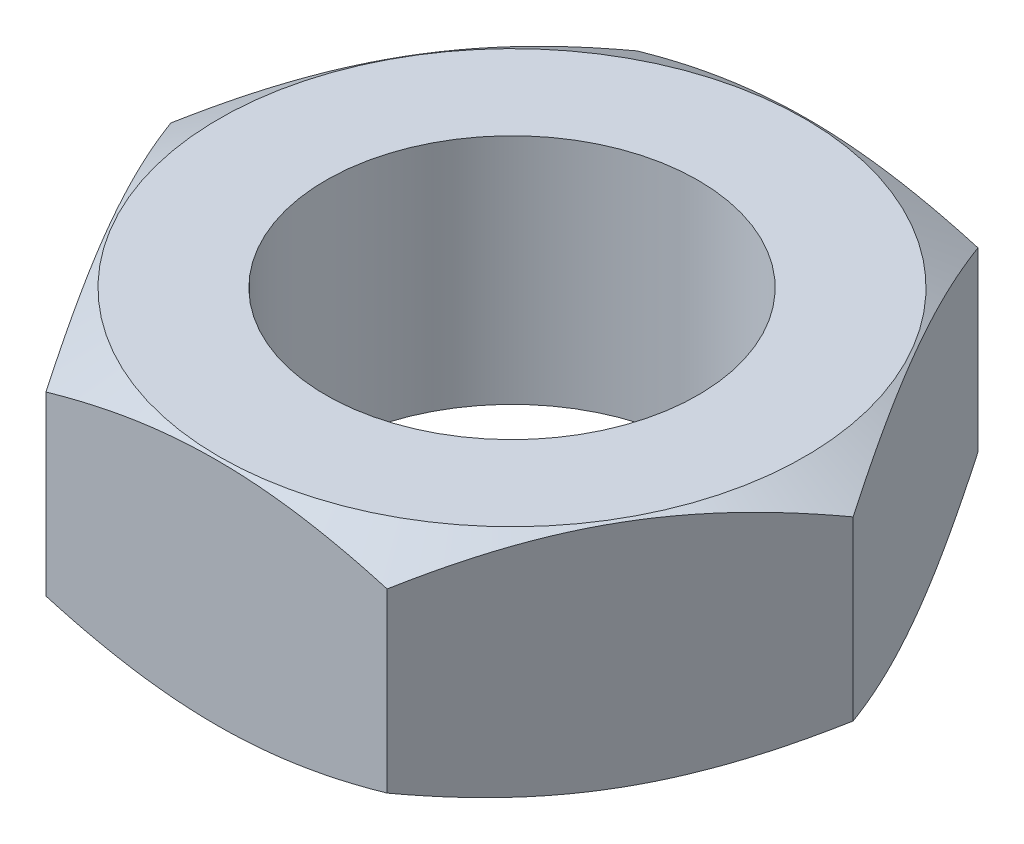
ISO-10303-21;
HEADER;
FILE_DESCRIPTION(('STEP AP214'),'2;1');
FILE_NAME('part.step','',(''),(''),'','','');
FILE_SCHEMA(('AUTOMOTIVE_DESIGN { 1 0 10303 214 1 1 1 1 }'));
ENDSEC;
DATA;
#1=APPLICATION_CONTEXT('core data for automotive mechanical design processes');
#2=APPLICATION_PROTOCOL_DEFINITION('international standard','automotive_design',2000,#1);
#3=PRODUCT_CONTEXT('',#1,'mechanical');
#4=PRODUCT('Part','Part','',(#3));
#5=PRODUCT_RELATED_PRODUCT_CATEGORY('part','',(#4));
#6=PRODUCT_DEFINITION_FORMATION('','',#4);
#7=PRODUCT_DEFINITION_CONTEXT('part definition',#1,'design');
#8=PRODUCT_DEFINITION('design','',#6,#7);
#9=PRODUCT_DEFINITION_SHAPE('','',#8);
#10=(LENGTH_UNIT() NAMED_UNIT(*) SI_UNIT(.MILLI.,.METRE.));
#11=(NAMED_UNIT(*) PLANE_ANGLE_UNIT() SI_UNIT($,.RADIAN.));
#12=(NAMED_UNIT(*) SI_UNIT($,.STERADIAN.) SOLID_ANGLE_UNIT());
#13=UNCERTAINTY_MEASURE_WITH_UNIT(LENGTH_MEASURE(1.E-05),#10,'distance_accuracy_value','');
#14=(GEOMETRIC_REPRESENTATION_CONTEXT(3) GLOBAL_UNCERTAINTY_ASSIGNED_CONTEXT((#13)) GLOBAL_UNIT_ASSIGNED_CONTEXT((#10,
#11,#12)) REPRESENTATION_CONTEXT('',''));
#15=CARTESIAN_POINT('',(0.,0.,0.));
#16=DIRECTION('',(0.,0.,1.));
#17=DIRECTION('',(1.,0.,0.));
#18=AXIS2_PLACEMENT_3D('',#15,#16,#17);
#19=CARTESIAN_POINT('',(0.,-1.25,0.));
#20=DIRECTION('',(0.,-1.,0.));
#21=DIRECTION('',(0.,0.,-1.));
#22=AXIS2_PLACEMENT_3D('',#19,#20,#21);
#23=PLANE('',#22);
#24=CARTESIAN_POINT('',(0.,-1.25,0.));
#25=DIRECTION('',(0.,-1.,0.));
#26=DIRECTION('',(0.,0.,-1.));
#27=AXIS2_PLACEMENT_3D('',#24,#25,#26);
#28=CIRCLE('',#27,2.);
#29=CARTESIAN_POINT('',(0.,-1.25,-2.));
#30=VERTEX_POINT('',#29);
#31=EDGE_CURVE('E198',#30,#30,#28,.T.);
#32=ORIENTED_EDGE('',*,*,#31,.F.);
#33=EDGE_LOOP('',(#32));
#34=FACE_BOUND('',#33,.T.);
#35=CARTESIAN_POINT('',(0.,-1.25,0.));
#36=DIRECTION('',(0.,1.,0.));
#37=DIRECTION('',(0.,0.,1.));
#38=AXIS2_PLACEMENT_3D('',#35,#36,#37);
#39=CIRCLE('',#38,3.14655896708346);
#40=CARTESIAN_POINT('',(0.,-1.25,3.14655896708346));
#41=VERTEX_POINT('',#40);
#42=EDGE_CURVE('E259',#41,#41,#39,.T.);
#43=ORIENTED_EDGE('',*,*,#42,.F.);
#44=EDGE_LOOP('',(#43));
#45=FACE_BOUND('',#44,.T.);
#46=ADVANCED_FACE('F41',(#34,#45),#23,.T.);
#47=CARTESIAN_POINT('',(0.,1.25,0.));
#48=DIRECTION('',(0.,-1.,0.));
#49=DIRECTION('',(0.,0.,-1.));
#50=AXIS2_PLACEMENT_3D('',#47,#48,#49);
#51=PLANE('',#50);
#52=CARTESIAN_POINT('',(0.,1.25,0.));
#53=DIRECTION('',(0.,-1.,0.));
#54=DIRECTION('',(0.,0.,-1.));
#55=AXIS2_PLACEMENT_3D('',#52,#53,#54);
#56=CIRCLE('',#55,2.);
#57=CARTESIAN_POINT('',(0.,1.25,-2.));
#58=VERTEX_POINT('',#57);
#59=EDGE_CURVE('E196',#58,#58,#56,.T.);
#60=ORIENTED_EDGE('',*,*,#59,.T.);
#61=EDGE_LOOP('',(#60));
#62=FACE_BOUND('',#61,.T.);
#63=CARTESIAN_POINT('',(0.,1.25,0.));
#64=DIRECTION('',(0.,1.,0.));
#65=DIRECTION('',(0.,0.,1.));
#66=AXIS2_PLACEMENT_3D('',#63,#64,#65);
#67=CIRCLE('',#66,3.14655896708346);
#68=CARTESIAN_POINT('',(0.,1.25,3.14655896708346));
#69=VERTEX_POINT('',#68);
#70=EDGE_CURVE('E256',#69,#69,#67,.T.);
#71=ORIENTED_EDGE('',*,*,#70,.T.);
#72=EDGE_LOOP('',(#71));
#73=FACE_BOUND('',#72,.T.);
#74=ADVANCED_FACE('F238',(#62,#73),#51,.F.);
#75=CARTESIAN_POINT('',(0.,-1.25,0.));
#76=DIRECTION('',(0.,1.,0.));
#77=DIRECTION('',(0.,0.,1.));
#78=AXIS2_PLACEMENT_3D('',#75,#76,#77);
#79=CYLINDRICAL_SURFACE('',#78,2.);
#80=ORIENTED_EDGE('',*,*,#31,.T.);
#81=EDGE_LOOP('',(#80));
#82=FACE_BOUND('',#81,.T.);
#83=ORIENTED_EDGE('',*,*,#59,.F.);
#84=EDGE_LOOP('',(#83));
#85=FACE_BOUND('',#84,.T.);
#86=ADVANCED_FACE('F141',(#82,#85),#79,.F.);
#87=CARTESIAN_POINT('',(0.,-0.95,0.));
#88=DIRECTION('',(0.,1.,0.));
#89=DIRECTION('',(0.,0.,1.));
#90=AXIS2_PLACEMENT_3D('',#87,#88,#89);
#91=CONICAL_SURFACE('',#90,3.66617420935412,1.0471975511966);
#92=ORIENTED_EDGE('',*,*,#42,.T.);
#93=EDGE_LOOP('',(#92));
#94=FACE_BOUND('',#93,.T.);
#95=CARTESIAN_POINT('',(1.83297163462323,-0.949933330183825,-3.1752));
#96=CARTESIAN_POINT('',(1.91352665998975,-0.996459627966395,-3.03567460326018));
#97=CARTESIAN_POINT('',(1.99477703088899,-1.03877369708128,-2.89494483272887));
#98=CARTESIAN_POINT('',(2.1586847273538,-1.11263355328131,-2.61104837470026));
#99=CARTESIAN_POINT('',(2.24134496547056,-1.14415321108056,-2.46787664251628));
#100=CARTESIAN_POINT('',(2.40564101629246,-1.19321845700633,-2.18330753500984));
#101=CARTESIAN_POINT('',(2.48725154909053,-1.21109059508647,-2.04195394577081));
#102=CARTESIAN_POINT('',(2.65085664790703,-1.2324267479573,-1.7585816022433));
#103=CARTESIAN_POINT('',(2.73285061920893,-1.2359084303577,-1.61656387803408));
#104=CARTESIAN_POINT('',(2.88606277807967,-1.22866786126739,-1.35119263453263));
#105=CARTESIAN_POINT('',(2.95730389328231,-1.21972341584597,-1.22779940341379));
#106=CARTESIAN_POINT('',(3.09932198517026,-1.19137398562116,-0.981816852669884));
#107=CARTESIAN_POINT('',(3.17009847059057,-1.17195931527969,-0.859228383940738));
#108=CARTESIAN_POINT('',(3.31240941048281,-1.12342383117838,-0.612738605574498));
#109=CARTESIAN_POINT('',(3.38392585192423,-1.0940972635168,-0.488868495421443));
#110=CARTESIAN_POINT('',(3.52589204292736,-1.02753736832745,-0.242975839646996));
#111=CARTESIAN_POINT('',(3.59634361148865,-0.99031968153969,-0.120950143425914));
#112=CARTESIAN_POINT('',(3.66628967940796,-0.949933330183827,0.000199999999998595));
#113=B_SPLINE_CURVE_WITH_KNOTS('',3,(#95,#96,#97,#98,#99,#100,#101,#102,#103,#104,#105,#106,
#107,#108,#109,#110,#111,#112),.UNSPECIFIED.,.F.,.F.,(4,2,2,2,2,2,2,2,4),(0.,0.503278731073366,
1.00776724301492,1.49976968502821,1.9911679005965,2.41904879402148,2.84732618162394,
3.28510386250597,3.72202181665388),.UNSPECIFIED.);
#114=CARTESIAN_POINT('',(1.83308710467706,-0.95,-3.175));
#115=VERTEX_POINT('',#114);
#116=CARTESIAN_POINT('',(3.66617420935412,-0.95,0.));
#117=VERTEX_POINT('',#116);
#118=EDGE_CURVE('E101',#115,#117,#113,.T.);
#119=ORIENTED_EDGE('',*,*,#118,.T.);
#120=CARTESIAN_POINT('',(3.66628967940796,-0.949933330183827,-0.000200000000000431));
#121=CARTESIAN_POINT('',(3.58573465404144,-0.996459627966396,0.139325396739818));
#122=CARTESIAN_POINT('',(3.50448428314219,-1.03877369708128,0.280055167271128));
#123=CARTESIAN_POINT('',(3.34057658667739,-1.11263355328131,0.563951625299741));
#124=CARTESIAN_POINT('',(3.25791634856063,-1.14415321108056,0.707123357483716));
#125=CARTESIAN_POINT('',(3.09362029773873,-1.19321845700633,0.991692464990165));
#126=CARTESIAN_POINT('',(3.01200976494066,-1.21109059508647,1.1330460542292));
#127=CARTESIAN_POINT('',(2.84840466612415,-1.2324267479573,1.4164183977567));
#128=CARTESIAN_POINT('',(2.76641069482226,-1.2359084303577,1.55843612196593));
#129=CARTESIAN_POINT('',(2.61319853595151,-1.22866786126739,1.82380736546737));
#130=CARTESIAN_POINT('',(2.54195742074888,-1.21972341584597,1.94720059658621));
#131=CARTESIAN_POINT('',(2.39993932886093,-1.19137398562116,2.19318314733012));
#132=CARTESIAN_POINT('',(2.32916284344061,-1.1719593152797,2.31577161605926));
#133=CARTESIAN_POINT('',(2.18685190354837,-1.12342383117838,2.5622613944255));
#134=CARTESIAN_POINT('',(2.11533546210696,-1.0940972635168,2.68613150457856));
#135=CARTESIAN_POINT('',(1.97336927110383,-1.02753736832745,2.932024160353));
#136=CARTESIAN_POINT('',(1.90291770254254,-0.99031968153969,3.05404985657409));
#137=CARTESIAN_POINT('',(1.83297163462323,-0.949933330183827,3.1752));
#138=B_SPLINE_CURVE_WITH_KNOTS('',3,(#120,#121,#122,#123,#124,#125,#126,#127,#128,#129,#130,
#131,#132,#133,#134,#135,#136,#137),.UNSPECIFIED.,.F.,.F.,(4,2,2,2,2,2,2,2,4),(0.,
0.503278731073366,1.00776724301492,1.49976968502821,1.9911679005965,2.41904879402148,
2.84732618162393,3.28510386250597,3.72202181665388),.UNSPECIFIED.);
#139=CARTESIAN_POINT('',(1.83308710467706,-0.95,3.175));
#140=VERTEX_POINT('',#139);
#141=EDGE_CURVE('E97',#117,#140,#138,.T.);
#142=ORIENTED_EDGE('',*,*,#141,.T.);
#143=CARTESIAN_POINT('',(5.51171521099277,0.605736250910529,3.175));
#144=CARTESIAN_POINT('',(5.37979871793226,0.539751065297416,3.175));
#145=CARTESIAN_POINT('',(5.24765205834997,0.474221195927034,3.175));
#146=CARTESIAN_POINT('',(4.98279349023958,0.344292134590762,3.175));
#147=CARTESIAN_POINT('',(4.85008154455377,0.279893018423128,3.175));
#148=CARTESIAN_POINT('',(4.58373696154433,0.152325963988015,3.175));
#149=CARTESIAN_POINT('',(4.45010300772905,0.0891607685535177,3.175));
#150=CARTESIAN_POINT('',(4.18205975046093,-0.0354987653282683,3.175));
#151=CARTESIAN_POINT('',(4.04765046224957,-0.0969931364857635,3.175));
#152=CARTESIAN_POINT('',(3.7718361028333,-0.220647201903418,3.175));
#153=CARTESIAN_POINT('',(3.63038845935846,-0.282712253143556,3.175));
#154=CARTESIAN_POINT('',(3.34628778194245,-0.404016285280332,3.175));
#155=CARTESIAN_POINT('',(3.20363479040986,-0.463255365121696,3.175));
#156=CARTESIAN_POINT('',(2.91696653993373,-0.578114998683086,3.175));
#157=CARTESIAN_POINT('',(2.77295212185764,-0.633737637641035,3.175));
#158=CARTESIAN_POINT('',(2.48324225262746,-0.740391304883294,3.175));
#159=CARTESIAN_POINT('',(2.33754698760164,-0.791422836160129,3.175));
#160=CARTESIAN_POINT('',(2.00982581103205,-0.898888336401685,3.175));
#161=CARTESIAN_POINT('',(1.82728675839257,-0.953786082052629,3.175));
#162=CARTESIAN_POINT('',(1.4589502135161,-1.05151893153533,3.175));
#163=CARTESIAN_POINT('',(1.2731530144879,-1.09435511495953,3.175));
#164=CARTESIAN_POINT('',(0.901718089153501,-1.16373404986914,3.175));
#165=CARTESIAN_POINT('',(0.716131399786595,-1.19054153671001,3.175));
#166=CARTESIAN_POINT('',(0.343238996115582,-1.22594880184509,3.175));
#167=CARTESIAN_POINT('',(0.155934047438269,-1.23455632829624,3.175));
#168=CARTESIAN_POINT('',(-0.219686448786184,-1.23241809052602,3.175));
#169=CARTESIAN_POINT('',(-0.408001312541329,-1.2215558274123,3.175));
#170=CARTESIAN_POINT('',(-0.782713595409705,-1.1817059302079,3.175));
#171=CARTESIAN_POINT('',(-0.969110076287176,-1.15270981905699,3.175));
#172=CARTESIAN_POINT('',(-1.34202374544874,-1.07917815101309,3.175));
#173=CARTESIAN_POINT('',(-1.52848873383983,-1.03438590778507,3.175));
#174=CARTESIAN_POINT('',(-1.89822739570804,-0.933018822812108,3.175));
#175=CARTESIAN_POINT('',(-2.08149921020955,-0.876437350756791,3.175));
#176=CARTESIAN_POINT('',(-2.4065371685003,-0.767502219463566,3.175));
#177=CARTESIAN_POINT('',(-2.54886529576136,-0.716795398220686,3.175));
#178=CARTESIAN_POINT('',(-2.83189347586891,-0.611156751473583,3.175));
#179=CARTESIAN_POINT('',(-2.97259396476513,-0.556226089190985,3.175));
#180=CARTESIAN_POINT('',(-3.25273748272035,-0.442997401294558,3.175));
#181=CARTESIAN_POINT('',(-3.39217958338415,-0.384697092507674,3.175));
#182=CARTESIAN_POINT('',(-3.66993004303759,-0.26545309063886,3.175));
#183=CARTESIAN_POINT('',(-3.80823836668191,-0.204509315517109,3.175));
#184=CARTESIAN_POINT('',(-4.07807615103167,-0.0831292224166281,3.175));
#185=CARTESIAN_POINT('',(-4.20964505745637,-0.0227803211305427,3.175));
#186=CARTESIAN_POINT('',(-4.47204255771311,0.0994979765031581,3.175));
#187=CARTESIAN_POINT('',(-4.60287116299798,0.161427348318021,3.175));
#188=CARTESIAN_POINT('',(-4.86367276902128,0.286474107249289,3.175));
#189=CARTESIAN_POINT('',(-4.99364687577518,0.349589192287732,3.175));
#190=CARTESIAN_POINT('',(-5.25305941543206,0.476902419828492,3.175));
#191=CARTESIAN_POINT('',(-5.38249786317646,0.541100532069968,3.175));
#192=CARTESIAN_POINT('',(-5.51171521099276,0.605736250910528,3.175));
#193=B_SPLINE_CURVE_WITH_KNOTS('',3,(#143,#144,#145,#146,#147,#148,#149,#150,#151,#152,#153,
#154,#155,#156,#157,#158,#159,#160,#161,#162,#163,#164,#165,#166,#167,#168,#169,#170,#171,#172,
#173,#174,#175,#176,#177,#178,#179,#180,#181,#182,#183,#184,#185,#186,#187,#188,#189,#190,#191,
#192),.UNSPECIFIED.,.F.,.F.,(4,2,2,2,2,2,2,2,2,2,2,2,2,2,2,2,2,2,2,2,2,2,2,2,4),(0.,
0.442499854594996,0.88502925909126,1.32845051903956,1.77186309173848,2.23523437082655,
2.69858941413641,3.16167487339169,3.62470953599437,4.19624728974484,4.76773387067823,
5.32950030060291,5.89102752497643,6.4559259120745,7.02108857076029,7.59589377926525,
8.17102313739134,8.6242210954403,9.07729468931304,9.53067895568921,9.98407730290115,
10.418312899667,10.8525417601335,11.2860004089142,11.719446966429),.UNSPECIFIED.);
#194=CARTESIAN_POINT('',(-1.83308710467706,-0.95,3.175));
#195=VERTEX_POINT('',#194);
#196=EDGE_CURVE('E102',#140,#195,#193,.T.);
#197=ORIENTED_EDGE('',*,*,#196,.T.);
#198=CARTESIAN_POINT('',(-1.83297163462322,-0.949933330183827,3.1752));
#199=CARTESIAN_POINT('',(-1.91352665998975,-0.996459627966396,3.03567460326018));
#200=CARTESIAN_POINT('',(-1.99477703088899,-1.03877369708128,2.89494483272887));
#201=CARTESIAN_POINT('',(-2.15868472735379,-1.11263355328131,2.61104837470026));
#202=CARTESIAN_POINT('',(-2.24134496547056,-1.14415321108056,2.46787664251628));
#203=CARTESIAN_POINT('',(-2.40564101629246,-1.19321845700633,2.18330753500984));
#204=CARTESIAN_POINT('',(-2.48725154909053,-1.21109059508647,2.04195394577081));
#205=CARTESIAN_POINT('',(-2.65085664790703,-1.2324267479573,1.7585816022433));
#206=CARTESIAN_POINT('',(-2.73285061920892,-1.2359084303577,1.61656387803408));
#207=CARTESIAN_POINT('',(-2.88606277807967,-1.22866786126739,1.35119263453263));
#208=CARTESIAN_POINT('',(-2.95730389328231,-1.21972341584597,1.22779940341379));
#209=CARTESIAN_POINT('',(-3.09932198517025,-1.19137398562116,0.981816852669884));
#210=CARTESIAN_POINT('',(-3.17009847059057,-1.1719593152797,0.859228383940737));
#211=CARTESIAN_POINT('',(-3.31240941048281,-1.12342383117838,0.612738605574497));
#212=CARTESIAN_POINT('',(-3.38392585192423,-1.0940972635168,0.488868495421442));
#213=CARTESIAN_POINT('',(-3.52589204292736,-1.02753736832745,0.242975839646995));
#214=CARTESIAN_POINT('',(-3.59634361148865,-0.990319681539691,0.120950143425914));
#215=CARTESIAN_POINT('',(-3.66628967940796,-0.949933330183827,-0.0001999999999994));
#216=B_SPLINE_CURVE_WITH_KNOTS('',3,(#198,#199,#200,#201,#202,#203,#204,#205,#206,#207,#208,
#209,#210,#211,#212,#213,#214,#215),.UNSPECIFIED.,.F.,.F.,(4,2,2,2,2,2,2,2,4),(0.,
0.503278731073366,1.00776724301492,1.49976968502821,1.9911679005965,2.41904879402148,
2.84732618162394,3.28510386250597,3.72202181665388),.UNSPECIFIED.);
#217=CARTESIAN_POINT('',(-3.66617420935412,-0.95,0.));
#218=VERTEX_POINT('',#217);
#219=EDGE_CURVE('E120',#195,#218,#216,.T.);
#220=ORIENTED_EDGE('',*,*,#219,.T.);
#221=CARTESIAN_POINT('',(-3.66628967940796,-0.949933330183827,0.000200000000000672));
#222=CARTESIAN_POINT('',(-3.58573465404144,-0.996459627966396,-0.139325396739818));
#223=CARTESIAN_POINT('',(-3.50448428314219,-1.03877369708128,-0.280055167271128));
#224=CARTESIAN_POINT('',(-3.34057658667739,-1.11263355328132,-0.56395162529974));
#225=CARTESIAN_POINT('',(-3.25791634856063,-1.14415321108056,-0.707123357483716));
#226=CARTESIAN_POINT('',(-3.09362029773873,-1.19321845700633,-0.991692464990165));
#227=CARTESIAN_POINT('',(-3.01200976494065,-1.21109059508647,-1.1330460542292));
#228=CARTESIAN_POINT('',(-2.84840466612415,-1.2324267479573,-1.4164183977567));
#229=CARTESIAN_POINT('',(-2.76641069482226,-1.2359084303577,-1.55843612196592));
#230=CARTESIAN_POINT('',(-2.61319853595151,-1.22866786126739,-1.82380736546737));
#231=CARTESIAN_POINT('',(-2.54195742074888,-1.21972341584597,-1.94720059658621));
#232=CARTESIAN_POINT('',(-2.39993932886093,-1.19137398562116,-2.19318314733012));
#233=CARTESIAN_POINT('',(-2.32916284344061,-1.1719593152797,-2.31577161605926));
#234=CARTESIAN_POINT('',(-2.18685190354837,-1.12342383117838,-2.5622613944255));
#235=CARTESIAN_POINT('',(-2.11533546210696,-1.0940972635168,-2.68613150457856));
#236=CARTESIAN_POINT('',(-1.97336927110383,-1.02753736832745,-2.93202416035301));
#237=CARTESIAN_POINT('',(-1.90291770254254,-0.99031968153969,-3.05404985657409));
#238=CARTESIAN_POINT('',(-1.83297163462322,-0.949933330183827,-3.1752));
#239=B_SPLINE_CURVE_WITH_KNOTS('',3,(#221,#222,#223,#224,#225,#226,#227,#228,#229,#230,#231,
#232,#233,#234,#235,#236,#237,#238),.UNSPECIFIED.,.F.,.F.,(4,2,2,2,2,2,2,2,4),(0.,
0.503278731073367,1.00776724301492,1.49976968502821,1.9911679005965,2.41904879402148,
2.84732618162394,3.28510386250597,3.72202181665389),.UNSPECIFIED.);
#240=CARTESIAN_POINT('',(-1.83308710467706,-0.95,-3.175));
#241=VERTEX_POINT('',#240);
#242=EDGE_CURVE('E65',#218,#241,#239,.T.);
#243=ORIENTED_EDGE('',*,*,#242,.T.);
#244=CARTESIAN_POINT('',(-5.51171521099276,0.605736250910528,-3.175));
#245=CARTESIAN_POINT('',(-5.37979871793226,0.539751065297416,-3.175));
#246=CARTESIAN_POINT('',(-5.24765205834997,0.474221195927034,-3.175));
#247=CARTESIAN_POINT('',(-4.98279349023958,0.344292134590762,-3.175));
#248=CARTESIAN_POINT('',(-4.85008154455376,0.279893018423128,-3.175));
#249=CARTESIAN_POINT('',(-4.58373696154432,0.152325963988014,-3.175));
#250=CARTESIAN_POINT('',(-4.45010300772905,0.0891607685535168,-3.175));
#251=CARTESIAN_POINT('',(-4.18205975046092,-0.0354987653282692,-3.175));
#252=CARTESIAN_POINT('',(-4.04765046224956,-0.0969931364857645,-3.175));
#253=CARTESIAN_POINT('',(-3.7718361028333,-0.220647201903419,-3.175));
#254=CARTESIAN_POINT('',(-3.63038845935845,-0.282712253143557,-3.175));
#255=CARTESIAN_POINT('',(-3.34628778194244,-0.404016285280333,-3.175));
#256=CARTESIAN_POINT('',(-3.20363479040986,-0.463255365121697,-3.175));
#257=CARTESIAN_POINT('',(-2.91696653993373,-0.578114998683086,-3.175));
#258=CARTESIAN_POINT('',(-2.77295212185764,-0.633737637641035,-3.175));
#259=CARTESIAN_POINT('',(-2.48324225262746,-0.740391304883294,-3.175));
#260=CARTESIAN_POINT('',(-2.33754698760164,-0.791422836160129,-3.175));
#261=CARTESIAN_POINT('',(-2.00982581103205,-0.898888336401685,-3.175));
#262=CARTESIAN_POINT('',(-1.82728675839257,-0.953786082052628,-3.175));
#263=CARTESIAN_POINT('',(-1.4589502135161,-1.05151893153533,-3.175));
#264=CARTESIAN_POINT('',(-1.2731530144879,-1.09435511495953,-3.175));
#265=CARTESIAN_POINT('',(-0.9017180891535,-1.16373404986914,-3.175));
#266=CARTESIAN_POINT('',(-0.716131399786593,-1.19054153671001,-3.175));
#267=CARTESIAN_POINT('',(-0.343238996115581,-1.22594880184509,-3.175));
#268=CARTESIAN_POINT('',(-0.155934047438267,-1.23455632829624,-3.175));
#269=CARTESIAN_POINT('',(0.219686448786186,-1.23241809052602,-3.175));
#270=CARTESIAN_POINT('',(0.408001312541331,-1.2215558274123,-3.175));
#271=CARTESIAN_POINT('',(0.782713595409708,-1.18170593020789,-3.175));
#272=CARTESIAN_POINT('',(0.969110076287178,-1.15270981905699,-3.175));
#273=CARTESIAN_POINT('',(1.34202374544874,-1.07917815101309,-3.175));
#274=CARTESIAN_POINT('',(1.52848873383983,-1.03438590778507,-3.175));
#275=CARTESIAN_POINT('',(1.89822739570804,-0.933018822812106,-3.175));
#276=CARTESIAN_POINT('',(2.08149921020955,-0.87643735075679,-3.175));
#277=CARTESIAN_POINT('',(2.4065371685003,-0.767502219463565,-3.175));
#278=CARTESIAN_POINT('',(2.54886529576137,-0.716795398220684,-3.175));
#279=CARTESIAN_POINT('',(2.83189347586891,-0.611156751473582,-3.175));
#280=CARTESIAN_POINT('',(2.97259396476513,-0.556226089190983,-3.175));
#281=CARTESIAN_POINT('',(3.25273748272036,-0.442997401294556,-3.175));
#282=CARTESIAN_POINT('',(3.39217958338415,-0.384697092507672,-3.175));
#283=CARTESIAN_POINT('',(3.66993004303759,-0.265453090638859,-3.175));
#284=CARTESIAN_POINT('',(3.80823836668191,-0.204509315517107,-3.175));
#285=CARTESIAN_POINT('',(4.07807615103167,-0.0831292224166266,-3.175));
#286=CARTESIAN_POINT('',(4.20964505745637,-0.0227803211305412,-3.175));
#287=CARTESIAN_POINT('',(4.47204255771312,0.0994979765031594,-3.175));
#288=CARTESIAN_POINT('',(4.60287116299798,0.161427348318022,-3.175));
#289=CARTESIAN_POINT('',(4.86367276902128,0.28647410724929,-3.175));
#290=CARTESIAN_POINT('',(4.99364687577518,0.349589192287733,-3.175));
#291=CARTESIAN_POINT('',(5.25305941543206,0.476902419828493,-3.175));
#292=CARTESIAN_POINT('',(5.38249786317646,0.541100532069969,-3.175));
#293=CARTESIAN_POINT('',(5.51171521099277,0.605736250910529,-3.175));
#294=B_SPLINE_CURVE_WITH_KNOTS('',3,(#244,#245,#246,#247,#248,#249,#250,#251,#252,#253,#254,
#255,#256,#257,#258,#259,#260,#261,#262,#263,#264,#265,#266,#267,#268,#269,#270,#271,#272,#273,
#274,#275,#276,#277,#278,#279,#280,#281,#282,#283,#284,#285,#286,#287,#288,#289,#290,#291,#292,
#293),.UNSPECIFIED.,.F.,.F.,(4,2,2,2,2,2,2,2,2,2,2,2,2,2,2,2,2,2,2,2,2,2,2,2,4),(0.,
0.442499854594995,0.885029259091261,1.32845051903956,1.77186309173848,2.23523437082655,
2.69858941413641,3.16167487339169,3.62470953599437,4.19624728974483,4.76773387067823,
5.32950030060291,5.89102752497643,6.45592591207449,7.02108857076029,7.59589377926525,
8.17102313739133,8.6242210954403,9.07729468931303,9.5306789556892,9.98407730290114,
10.418312899667,10.8525417601335,11.2860004089142,11.719446966429),.UNSPECIFIED.);
#295=EDGE_CURVE('E57',#241,#115,#294,.T.);
#296=ORIENTED_EDGE('',*,*,#295,.T.);
#297=EDGE_LOOP('',(#119,#142,#197,#220,#243,#296));
#298=FACE_BOUND('',#297,.T.);
#299=ADVANCED_FACE('F99',(#94,#298),#91,.T.);
#300=CARTESIAN_POINT('',(0.,1.25,0.));
#301=DIRECTION('',(0.,-1.,0.));
#302=DIRECTION('',(0.,0.,-1.));
#303=AXIS2_PLACEMENT_3D('',#300,#301,#302);
#304=CONICAL_SURFACE('',#303,3.14655896708346,1.0471975511966);
#305=ORIENTED_EDGE('',*,*,#70,.F.);
#306=EDGE_LOOP('',(#305));
#307=FACE_BOUND('',#306,.T.);
#308=CARTESIAN_POINT('',(3.66628967940796,0.949933330183825,0.000199999999999205));
#309=CARTESIAN_POINT('',(3.58573465404144,0.996459627966395,-0.139325396739819));
#310=CARTESIAN_POINT('',(3.50448428314219,1.03877369708128,-0.280055167271129));
#311=CARTESIAN_POINT('',(3.34057658667739,1.11263355328131,-0.563951625299742));
#312=CARTESIAN_POINT('',(3.25791634856063,1.14415321108056,-0.707123357483718));
#313=CARTESIAN_POINT('',(3.09362029773873,1.19321845700633,-0.991692464990167));
#314=CARTESIAN_POINT('',(3.01200976494065,1.21109059508647,-1.1330460542292));
#315=CARTESIAN_POINT('',(2.84840466612415,1.2324267479573,-1.41641839775671));
#316=CARTESIAN_POINT('',(2.76641069482226,1.2359084303577,-1.55843612196593));
#317=CARTESIAN_POINT('',(2.61319853595151,1.22866786126739,-1.82380736546737));
#318=CARTESIAN_POINT('',(2.54195742074888,1.21972341584597,-1.94720059658621));
#319=CARTESIAN_POINT('',(2.39993932886093,1.19137398562116,-2.19318314733012));
#320=CARTESIAN_POINT('',(2.32916284344061,1.17195931527969,-2.31577161605926));
#321=CARTESIAN_POINT('',(2.18685190354837,1.12342383117838,-2.5622613944255));
#322=CARTESIAN_POINT('',(2.11533546210696,1.0940972635168,-2.68613150457856));
#323=CARTESIAN_POINT('',(1.97336927110383,1.02753736832744,-2.93202416035301));
#324=CARTESIAN_POINT('',(1.90291770254254,0.990319681539689,-3.05404985657409));
#325=CARTESIAN_POINT('',(1.83297163462323,0.949933330183825,-3.1752));
#326=B_SPLINE_CURVE_WITH_KNOTS('',3,(#308,#309,#310,#311,#312,#313,#314,#315,#316,#317,#318,
#319,#320,#321,#322,#323,#324,#325),.UNSPECIFIED.,.F.,.F.,(4,2,2,2,2,2,2,2,4),(0.,
0.503278731073367,1.00776724301492,1.49976968502821,1.9911679005965,2.41904879402148,
2.84732618162394,3.28510386250597,3.72202181665388),.UNSPECIFIED.);
#327=CARTESIAN_POINT('',(3.66617420935412,0.95,0.));
#328=VERTEX_POINT('',#327);
#329=CARTESIAN_POINT('',(1.83308710467706,0.949999999999996,-3.175));
#330=VERTEX_POINT('',#329);
#331=EDGE_CURVE('E68',#328,#330,#326,.T.);
#332=ORIENTED_EDGE('',*,*,#331,.T.);
#333=CARTESIAN_POINT('',(5.51171521099277,-0.605736250910529,-3.175));
#334=CARTESIAN_POINT('',(5.37979871793226,-0.539751065297417,-3.175));
#335=CARTESIAN_POINT('',(5.24765205834997,-0.474221195927036,-3.175));
#336=CARTESIAN_POINT('',(4.98279349023958,-0.344292134590763,-3.175));
#337=CARTESIAN_POINT('',(4.85008154455377,-0.279893018423129,-3.175));
#338=CARTESIAN_POINT('',(4.58373696154433,-0.152325963988015,-3.175));
#339=CARTESIAN_POINT('',(4.45010300772905,-0.0891607685535181,-3.175));
#340=CARTESIAN_POINT('',(4.18205975046093,0.0354987653282678,-3.175));
#341=CARTESIAN_POINT('',(4.04765046224957,0.0969931364857628,-3.175));
#342=CARTESIAN_POINT('',(3.7718361028333,0.220647201903417,-3.175));
#343=CARTESIAN_POINT('',(3.63038845935845,0.282712253143555,-3.175));
#344=CARTESIAN_POINT('',(3.34628778194244,0.404016285280332,-3.175));
#345=CARTESIAN_POINT('',(3.20363479040986,0.463255365121696,-3.175));
#346=CARTESIAN_POINT('',(2.91696653993373,0.578114998683085,-3.175));
#347=CARTESIAN_POINT('',(2.77295212185764,0.633737637641034,-3.175));
#348=CARTESIAN_POINT('',(2.48324225262746,0.740391304883293,-3.175));
#349=CARTESIAN_POINT('',(2.33754698760164,0.791422836160129,-3.175));
#350=CARTESIAN_POINT('',(2.00982581103205,0.898888336401685,-3.175));
#351=CARTESIAN_POINT('',(1.82728675839257,0.953786082052628,-3.175));
#352=CARTESIAN_POINT('',(1.4589502135161,1.05151893153533,-3.175));
#353=CARTESIAN_POINT('',(1.2731530144879,1.09435511495953,-3.175));
#354=CARTESIAN_POINT('',(0.901718089153501,1.16373404986914,-3.175));
#355=CARTESIAN_POINT('',(0.716131399786595,1.19054153671,-3.175));
#356=CARTESIAN_POINT('',(0.343238996115582,1.22594880184509,-3.175));
#357=CARTESIAN_POINT('',(0.155934047438269,1.23455632829624,-3.175));
#358=CARTESIAN_POINT('',(-0.219686448786185,1.23241809052602,-3.175));
#359=CARTESIAN_POINT('',(-0.40800131254133,1.2215558274123,-3.175));
#360=CARTESIAN_POINT('',(-0.782713595409706,1.1817059302079,-3.175));
#361=CARTESIAN_POINT('',(-0.969110076287177,1.15270981905699,-3.175));
#362=CARTESIAN_POINT('',(-1.34202374544874,1.07917815101309,-3.175));
#363=CARTESIAN_POINT('',(-1.52848873383983,1.03438590778507,-3.175));
#364=CARTESIAN_POINT('',(-1.89822739570804,0.933018822812106,-3.175));
#365=CARTESIAN_POINT('',(-2.08149921020955,0.87643735075679,-3.175));
#366=CARTESIAN_POINT('',(-2.4065371685003,0.767502219463565,-3.175));
#367=CARTESIAN_POINT('',(-2.54886529576137,0.716795398220684,-3.175));
#368=CARTESIAN_POINT('',(-2.83189347586891,0.611156751473582,-3.175));
#369=CARTESIAN_POINT('',(-2.97259396476513,0.556226089190984,-3.175));
#370=CARTESIAN_POINT('',(-3.25273748272035,0.442997401294557,-3.175));
#371=CARTESIAN_POINT('',(-3.39217958338415,0.384697092507673,-3.175));
#372=CARTESIAN_POINT('',(-3.66993004303759,0.26545309063886,-3.175));
#373=CARTESIAN_POINT('',(-3.80823836668191,0.204509315517108,-3.175));
#374=CARTESIAN_POINT('',(-4.07807615103167,0.0831292224166277,-3.175));
#375=CARTESIAN_POINT('',(-4.20964505745637,0.022780321130542,-3.175));
#376=CARTESIAN_POINT('',(-4.47204255771311,-0.099497976503159,-3.175));
#377=CARTESIAN_POINT('',(-4.60287116299798,-0.161427348318022,-3.175));
#378=CARTESIAN_POINT('',(-4.86367276902128,-0.28647410724929,-3.175));
#379=CARTESIAN_POINT('',(-4.99364687577518,-0.349589192287732,-3.175));
#380=CARTESIAN_POINT('',(-5.25305941543206,-0.476902419828492,-3.175));
#381=CARTESIAN_POINT('',(-5.38249786317646,-0.541100532069969,-3.175));
#382=CARTESIAN_POINT('',(-5.51171521099277,-0.605736250910529,-3.175));
#383=B_SPLINE_CURVE_WITH_KNOTS('',3,(#333,#334,#335,#336,#337,#338,#339,#340,#341,#342,#343,
#344,#345,#346,#347,#348,#349,#350,#351,#352,#353,#354,#355,#356,#357,#358,#359,#360,#361,#362,
#363,#364,#365,#366,#367,#368,#369,#370,#371,#372,#373,#374,#375,#376,#377,#378,#379,#380,#381,
#382),.UNSPECIFIED.,.F.,.F.,(4,2,2,2,2,2,2,2,2,2,2,2,2,2,2,2,2,2,2,2,2,2,2,2,4),(0.,
0.442499854594995,0.88502925909126,1.32845051903956,1.77186309173848,2.23523437082655,
2.69858941413641,3.16167487339169,3.62470953599437,4.19624728974483,4.76773387067823,
5.32950030060291,5.89102752497643,6.4559259120745,7.02108857076029,7.59589377926525,
8.17102313739134,8.6242210954403,9.07729468931303,9.5306789556892,9.98407730290114,
10.418312899667,10.8525417601335,11.2860004089142,11.719446966429),.UNSPECIFIED.);
#384=CARTESIAN_POINT('',(-1.83308710467706,0.95,-3.175));
#385=VERTEX_POINT('',#384);
#386=EDGE_CURVE('E11',#330,#385,#383,.T.);
#387=ORIENTED_EDGE('',*,*,#386,.T.);
#388=CARTESIAN_POINT('',(-1.83297163462322,0.949933330183825,-3.1752));
#389=CARTESIAN_POINT('',(-1.91352665998975,0.996459627966395,-3.03567460326018));
#390=CARTESIAN_POINT('',(-1.99477703088899,1.03877369708128,-2.89494483272887));
#391=CARTESIAN_POINT('',(-2.15868472735379,1.11263355328131,-2.61104837470026));
#392=CARTESIAN_POINT('',(-2.24134496547056,1.14415321108056,-2.46787664251629));
#393=CARTESIAN_POINT('',(-2.40564101629246,1.19321845700633,-2.18330753500984));
#394=CARTESIAN_POINT('',(-2.48725154909053,1.21109059508647,-2.04195394577081));
#395=CARTESIAN_POINT('',(-2.65085664790703,1.2324267479573,-1.7585816022433));
#396=CARTESIAN_POINT('',(-2.73285061920892,1.2359084303577,-1.61656387803408));
#397=CARTESIAN_POINT('',(-2.88606277807967,1.22866786126739,-1.35119263453263));
#398=CARTESIAN_POINT('',(-2.95730389328231,1.21972341584597,-1.22779940341379));
#399=CARTESIAN_POINT('',(-3.09932198517025,1.19137398562116,-0.981816852669884));
#400=CARTESIAN_POINT('',(-3.17009847059057,1.1719593152797,-0.859228383940737));
#401=CARTESIAN_POINT('',(-3.31240941048281,1.12342383117838,-0.612738605574497));
#402=CARTESIAN_POINT('',(-3.38392585192423,1.0940972635168,-0.488868495421442));
#403=CARTESIAN_POINT('',(-3.52589204292735,1.02753736832745,-0.242975839646995));
#404=CARTESIAN_POINT('',(-3.59634361148865,0.990319681539691,-0.120950143425913));
#405=CARTESIAN_POINT('',(-3.66628967940796,0.949933330183827,0.0002000000000004));
#406=B_SPLINE_CURVE_WITH_KNOTS('',3,(#388,#389,#390,#391,#392,#393,#394,#395,#396,#397,#398,
#399,#400,#401,#402,#403,#404,#405),.UNSPECIFIED.,.F.,.F.,(4,2,2,2,2,2,2,2,4),(0.,
0.503278731073367,1.00776724301492,1.49976968502821,1.9911679005965,2.41904879402148,
2.84732618162394,3.28510386250597,3.72202181665388),.UNSPECIFIED.);
#407=CARTESIAN_POINT('',(-3.66617420935412,0.95,0.));
#408=VERTEX_POINT('',#407);
#409=EDGE_CURVE('E218',#385,#408,#406,.T.);
#410=ORIENTED_EDGE('',*,*,#409,.T.);
#411=CARTESIAN_POINT('',(-3.66628967940796,0.949933330183827,-0.000199999999999412));
#412=CARTESIAN_POINT('',(-3.58573465404144,0.996459627966397,0.139325396739819));
#413=CARTESIAN_POINT('',(-3.50448428314219,1.03877369708128,0.280055167271129));
#414=CARTESIAN_POINT('',(-3.34057658667739,1.11263355328131,0.563951625299741));
#415=CARTESIAN_POINT('',(-3.25791634856063,1.14415321108056,0.707123357483717));
#416=CARTESIAN_POINT('',(-3.09362029773873,1.19321845700633,0.991692464990166));
#417=CARTESIAN_POINT('',(-3.01200976494065,1.21109059508647,1.1330460542292));
#418=CARTESIAN_POINT('',(-2.84840466612415,1.2324267479573,1.4164183977567));
#419=CARTESIAN_POINT('',(-2.76641069482226,1.2359084303577,1.55843612196593));
#420=CARTESIAN_POINT('',(-2.61319853595151,1.22866786126739,1.82380736546737));
#421=CARTESIAN_POINT('',(-2.54195742074887,1.21972341584597,1.94720059658621));
#422=CARTESIAN_POINT('',(-2.39993932886093,1.19137398562116,2.19318314733012));
#423=CARTESIAN_POINT('',(-2.32916284344061,1.1719593152797,2.31577161605926));
#424=CARTESIAN_POINT('',(-2.18685190354837,1.12342383117838,2.5622613944255));
#425=CARTESIAN_POINT('',(-2.11533546210696,1.0940972635168,2.68613150457856));
#426=CARTESIAN_POINT('',(-1.97336927110383,1.02753736832745,2.93202416035301));
#427=CARTESIAN_POINT('',(-1.90291770254254,0.990319681539691,3.05404985657409));
#428=CARTESIAN_POINT('',(-1.83297163462322,0.949933330183827,3.1752));
#429=B_SPLINE_CURVE_WITH_KNOTS('',3,(#411,#412,#413,#414,#415,#416,#417,#418,#419,#420,#421,
#422,#423,#424,#425,#426,#427,#428),.UNSPECIFIED.,.F.,.F.,(4,2,2,2,2,2,2,2,4),(0.,
0.503278731073366,1.00776724301492,1.49976968502821,1.9911679005965,2.41904879402148,
2.84732618162393,3.28510386250597,3.72202181665388),.UNSPECIFIED.);
#430=CARTESIAN_POINT('',(-1.83308710467706,0.95,3.175));
#431=VERTEX_POINT('',#430);
#432=EDGE_CURVE('E217',#408,#431,#429,.T.);
#433=ORIENTED_EDGE('',*,*,#432,.T.);
#434=CARTESIAN_POINT('',(-5.51171521099276,-0.605736250910528,3.175));
#435=CARTESIAN_POINT('',(-5.37979871793225,-0.539751065297416,3.175));
#436=CARTESIAN_POINT('',(-5.24765205834997,-0.474221195927034,3.175));
#437=CARTESIAN_POINT('',(-4.98279349023958,-0.344292134590762,3.175));
#438=CARTESIAN_POINT('',(-4.85008154455376,-0.279893018423128,3.175));
#439=CARTESIAN_POINT('',(-4.58373696154433,-0.152325963988014,3.175));
#440=CARTESIAN_POINT('',(-4.45010300772905,-0.0891607685535169,3.175));
#441=CARTESIAN_POINT('',(-4.18205975046093,0.0354987653282687,3.175));
#442=CARTESIAN_POINT('',(-4.04765046224956,0.0969931364857637,3.175));
#443=CARTESIAN_POINT('',(-3.7718361028333,0.220647201903418,3.175));
#444=CARTESIAN_POINT('',(-3.63038845935845,0.282712253143556,3.175));
#445=CARTESIAN_POINT('',(-3.34628778194244,0.404016285280332,3.175));
#446=CARTESIAN_POINT('',(-3.20363479040986,0.463255365121696,3.175));
#447=CARTESIAN_POINT('',(-2.91696653993373,0.578114998683085,3.175));
#448=CARTESIAN_POINT('',(-2.77295212185764,0.633737637641035,3.175));
#449=CARTESIAN_POINT('',(-2.48324225262746,0.740391304883294,3.175));
#450=CARTESIAN_POINT('',(-2.33754698760164,0.791422836160129,3.175));
#451=CARTESIAN_POINT('',(-2.00982581103205,0.898888336401685,3.175));
#452=CARTESIAN_POINT('',(-1.82728675839257,0.953786082052629,3.175));
#453=CARTESIAN_POINT('',(-1.4589502135161,1.05151893153533,3.175));
#454=CARTESIAN_POINT('',(-1.2731530144879,1.09435511495953,3.175));
#455=CARTESIAN_POINT('',(-0.9017180891535,1.16373404986914,3.175));
#456=CARTESIAN_POINT('',(-0.716131399786594,1.19054153671001,3.175));
#457=CARTESIAN_POINT('',(-0.343238996115581,1.22594880184509,3.175));
#458=CARTESIAN_POINT('',(-0.155934047438268,1.23455632829624,3.175));
#459=CARTESIAN_POINT('',(0.219686448786185,1.23241809052602,3.175));
#460=CARTESIAN_POINT('',(0.40800131254133,1.2215558274123,3.175));
#461=CARTESIAN_POINT('',(0.782713595409706,1.1817059302079,3.175));
#462=CARTESIAN_POINT('',(0.969110076287177,1.15270981905699,3.175));
#463=CARTESIAN_POINT('',(1.34202374544874,1.07917815101309,3.175));
#464=CARTESIAN_POINT('',(1.52848873383983,1.03438590778507,3.175));
#465=CARTESIAN_POINT('',(1.89822739570804,0.933018822812108,3.175));
#466=CARTESIAN_POINT('',(2.08149921020955,0.876437350756791,3.175));
#467=CARTESIAN_POINT('',(2.4065371685003,0.767502219463566,3.175));
#468=CARTESIAN_POINT('',(2.54886529576137,0.716795398220686,3.175));
#469=CARTESIAN_POINT('',(2.83189347586891,0.611156751473583,3.175));
#470=CARTESIAN_POINT('',(2.97259396476513,0.556226089190984,3.175));
#471=CARTESIAN_POINT('',(3.25273748272036,0.442997401294557,3.175));
#472=CARTESIAN_POINT('',(3.39217958338415,0.384697092507673,3.175));
#473=CARTESIAN_POINT('',(3.66993004303759,0.26545309063886,3.175));
#474=CARTESIAN_POINT('',(3.80823836668191,0.204509315517108,3.175));
#475=CARTESIAN_POINT('',(4.07807615103167,0.0831292224166276,3.175));
#476=CARTESIAN_POINT('',(4.20964505745637,0.0227803211305422,3.175));
#477=CARTESIAN_POINT('',(4.47204255771312,-0.0994979765031588,3.175));
#478=CARTESIAN_POINT('',(4.60287116299798,-0.161427348318022,3.175));
#479=CARTESIAN_POINT('',(4.86367276902128,-0.28647410724929,3.175));
#480=CARTESIAN_POINT('',(4.99364687577518,-0.349589192287732,3.175));
#481=CARTESIAN_POINT('',(5.25305941543207,-0.476902419828492,3.175));
#482=CARTESIAN_POINT('',(5.38249786317646,-0.541100532069968,3.175));
#483=CARTESIAN_POINT('',(5.51171521099277,-0.605736250910529,3.175));
#484=B_SPLINE_CURVE_WITH_KNOTS('',3,(#434,#435,#436,#437,#438,#439,#440,#441,#442,#443,#444,
#445,#446,#447,#448,#449,#450,#451,#452,#453,#454,#455,#456,#457,#458,#459,#460,#461,#462,#463,
#464,#465,#466,#467,#468,#469,#470,#471,#472,#473,#474,#475,#476,#477,#478,#479,#480,#481,#482,
#483),.UNSPECIFIED.,.F.,.F.,(4,2,2,2,2,2,2,2,2,2,2,2,2,2,2,2,2,2,2,2,2,2,2,2,4),(0.,
0.442499854594996,0.88502925909126,1.32845051903956,1.77186309173848,2.23523437082655,
2.69858941413641,3.16167487339169,3.62470953599437,4.19624728974483,4.76773387067823,
5.32950030060291,5.89102752497643,6.45592591207449,7.02108857076029,7.59589377926524,
8.17102313739133,8.6242210954403,9.07729468931303,9.5306789556892,9.98407730290114,
10.418312899667,10.8525417601335,11.2860004089142,11.719446966429),.UNSPECIFIED.);
#485=CARTESIAN_POINT('',(1.83308710467706,0.95,3.175));
#486=VERTEX_POINT('',#485);
#487=EDGE_CURVE('E187',#431,#486,#484,.T.);
#488=ORIENTED_EDGE('',*,*,#487,.T.);
#489=CARTESIAN_POINT('',(1.83297163462323,0.949933330183827,3.1752));
#490=CARTESIAN_POINT('',(1.91352665998975,0.996459627966396,3.03567460326018));
#491=CARTESIAN_POINT('',(1.99477703088899,1.03877369708128,2.89494483272887));
#492=CARTESIAN_POINT('',(2.1586847273538,1.11263355328131,2.61104837470026));
#493=CARTESIAN_POINT('',(2.24134496547056,1.14415321108056,2.46787664251628));
#494=CARTESIAN_POINT('',(2.40564101629246,1.19321845700633,2.18330753500983));
#495=CARTESIAN_POINT('',(2.48725154909053,1.21109059508647,2.0419539457708));
#496=CARTESIAN_POINT('',(2.65085664790703,1.2324267479573,1.75858160224329));
#497=CARTESIAN_POINT('',(2.73285061920893,1.2359084303577,1.61656387803407));
#498=CARTESIAN_POINT('',(2.88606277807967,1.22866786126739,1.35119263453263));
#499=CARTESIAN_POINT('',(2.95730389328231,1.21972341584597,1.22779940341379));
#500=CARTESIAN_POINT('',(3.09932198517026,1.19137398562116,0.981816852669883));
#501=CARTESIAN_POINT('',(3.17009847059057,1.17195931527969,0.859228383940737));
#502=CARTESIAN_POINT('',(3.31240941048281,1.12342383117838,0.612738605574496));
#503=CARTESIAN_POINT('',(3.38392585192423,1.0940972635168,0.488868495421441));
#504=CARTESIAN_POINT('',(3.52589204292736,1.02753736832745,0.242975839646994));
#505=CARTESIAN_POINT('',(3.59634361148865,0.990319681539689,0.120950143425913));
#506=CARTESIAN_POINT('',(3.66628967940796,0.949933330183825,-0.000200000000000325));
#507=B_SPLINE_CURVE_WITH_KNOTS('',3,(#489,#490,#491,#492,#493,#494,#495,#496,#497,#498,#499,
#500,#501,#502,#503,#504,#505,#506),.UNSPECIFIED.,.F.,.F.,(4,2,2,2,2,2,2,2,4),(0.,
0.503278731073367,1.00776724301492,1.49976968502821,1.9911679005965,2.41904879402148,
2.84732618162394,3.28510386250597,3.72202181665388),.UNSPECIFIED.);
#508=EDGE_CURVE('E122',#486,#328,#507,.T.);
#509=ORIENTED_EDGE('',*,*,#508,.T.);
#510=EDGE_LOOP('',(#332,#387,#410,#433,#488,#509));
#511=FACE_BOUND('',#510,.T.);
#512=ADVANCED_FACE('F139',(#307,#511),#304,.T.);
#513=CARTESIAN_POINT('',(-1.83308710467706,-1.25,-3.175));
#514=DIRECTION('',(0.,0.,1.));
#515=DIRECTION('',(1.,0.,0.));
#516=AXIS2_PLACEMENT_3D('',#513,#514,#515);
#517=PLANE('',#516);
#518=ORIENTED_EDGE('',*,*,#386,.F.);
#519=DIRECTION('',(0.,1.,0.));
#520=VECTOR('',#519,1.);
#521=CARTESIAN_POINT('',(1.83308710467706,-1.25,-3.175));
#522=LINE('',#521,#520);
#523=EDGE_CURVE('E201',#115,#330,#522,.T.);
#524=ORIENTED_EDGE('',*,*,#523,.F.);
#525=ORIENTED_EDGE('',*,*,#295,.F.);
#526=DIRECTION('',(0.,1.,0.));
#527=VECTOR('',#526,1.);
#528=CARTESIAN_POINT('',(-1.83308710467706,-1.25,-3.175));
#529=LINE('',#528,#527);
#530=EDGE_CURVE('E210',#241,#385,#529,.T.);
#531=ORIENTED_EDGE('',*,*,#530,.T.);
#532=EDGE_LOOP('',(#518,#524,#525,#531));
#533=FACE_BOUND('',#532,.T.);
#534=ADVANCED_FACE('F132',(#533),#517,.F.);
#535=CARTESIAN_POINT('',(-3.66617420935412,-1.25,0.));
#536=DIRECTION('',(0.866025403784439,0.,0.5));
#537=DIRECTION('',(0.5,0.,-0.866025403784439));
#538=AXIS2_PLACEMENT_3D('',#535,#536,#537);
#539=PLANE('',#538);
#540=ORIENTED_EDGE('',*,*,#409,.F.);
#541=ORIENTED_EDGE('',*,*,#530,.F.);
#542=ORIENTED_EDGE('',*,*,#242,.F.);
#543=DIRECTION('',(0.,1.,0.));
#544=VECTOR('',#543,1.);
#545=CARTESIAN_POINT('',(-3.66617420935412,-1.25,0.));
#546=LINE('',#545,#544);
#547=EDGE_CURVE('E128',#218,#408,#546,.T.);
#548=ORIENTED_EDGE('',*,*,#547,.T.);
#549=EDGE_LOOP('',(#540,#541,#542,#548));
#550=FACE_BOUND('',#549,.T.);
#551=ADVANCED_FACE('F215',(#550),#539,.F.);
#552=CARTESIAN_POINT('',(-1.83308710467706,-1.25,3.175));
#553=DIRECTION('',(0.866025403784439,0.,-0.5));
#554=DIRECTION('',(-0.5,0.,-0.866025403784439));
#555=AXIS2_PLACEMENT_3D('',#552,#553,#554);
#556=PLANE('',#555);
#557=ORIENTED_EDGE('',*,*,#432,.F.);
#558=ORIENTED_EDGE('',*,*,#547,.F.);
#559=ORIENTED_EDGE('',*,*,#219,.F.);
#560=DIRECTION('',(0.,1.,0.));
#561=VECTOR('',#560,1.);
#562=CARTESIAN_POINT('',(-1.83308710467706,-1.25,3.175));
#563=LINE('',#562,#561);
#564=EDGE_CURVE('E119',#195,#431,#563,.T.);
#565=ORIENTED_EDGE('',*,*,#564,.T.);
#566=EDGE_LOOP('',(#557,#558,#559,#565));
#567=FACE_BOUND('',#566,.T.);
#568=ADVANCED_FACE('F219',(#567),#556,.F.);
#569=CARTESIAN_POINT('',(1.83308710467706,-1.25,3.175));
#570=DIRECTION('',(0.,0.,-1.));
#571=DIRECTION('',(-1.,0.,0.));
#572=AXIS2_PLACEMENT_3D('',#569,#570,#571);
#573=PLANE('',#572);
#574=ORIENTED_EDGE('',*,*,#487,.F.);
#575=ORIENTED_EDGE('',*,*,#564,.F.);
#576=ORIENTED_EDGE('',*,*,#196,.F.);
#577=DIRECTION('',(0.,1.,0.));
#578=VECTOR('',#577,1.);
#579=CARTESIAN_POINT('',(1.83308710467706,-1.25,3.175));
#580=LINE('',#579,#578);
#581=EDGE_CURVE('E113',#140,#486,#580,.T.);
#582=ORIENTED_EDGE('',*,*,#581,.T.);
#583=EDGE_LOOP('',(#574,#575,#576,#582));
#584=FACE_BOUND('',#583,.T.);
#585=ADVANCED_FACE('F114',(#584),#573,.F.);
#586=CARTESIAN_POINT('',(3.66617420935412,-1.25,0.));
#587=DIRECTION('',(-0.866025403784439,0.,-0.5));
#588=DIRECTION('',(-0.5,0.,0.866025403784439));
#589=AXIS2_PLACEMENT_3D('',#586,#587,#588);
#590=PLANE('',#589);
#591=ORIENTED_EDGE('',*,*,#508,.F.);
#592=ORIENTED_EDGE('',*,*,#581,.F.);
#593=ORIENTED_EDGE('',*,*,#141,.F.);
#594=DIRECTION('',(0.,1.,0.));
#595=VECTOR('',#594,1.);
#596=CARTESIAN_POINT('',(3.66617420935412,-1.25,0.));
#597=LINE('',#596,#595);
#598=EDGE_CURVE('E121',#117,#328,#597,.T.);
#599=ORIENTED_EDGE('',*,*,#598,.T.);
#600=EDGE_LOOP('',(#591,#592,#593,#599));
#601=FACE_BOUND('',#600,.T.);
#602=ADVANCED_FACE('F123',(#601),#590,.F.);
#603=CARTESIAN_POINT('',(1.83308710467706,-1.25,-3.175));
#604=DIRECTION('',(-0.866025403784439,0.,0.5));
#605=DIRECTION('',(0.5,0.,0.866025403784439));
#606=AXIS2_PLACEMENT_3D('',#603,#604,#605);
#607=PLANE('',#606);
#608=ORIENTED_EDGE('',*,*,#331,.F.);
#609=ORIENTED_EDGE('',*,*,#598,.F.);
#610=ORIENTED_EDGE('',*,*,#118,.F.);
#611=ORIENTED_EDGE('',*,*,#523,.T.);
#612=EDGE_LOOP('',(#608,#609,#610,#611));
#613=FACE_BOUND('',#612,.T.);
#614=ADVANCED_FACE('F43',(#613),#607,.F.);
#615=CLOSED_SHELL('',(#46,#74,#86,#299,#512,#534,#551,#568,#585,#602,#614));
#616=MANIFOLD_SOLID_BREP('B2',#615);
#617=ADVANCED_BREP_SHAPE_REPRESENTATION('',(#18,#616),#14);
#618=SHAPE_DEFINITION_REPRESENTATION(#9,#617);
ENDSEC;
END-ISO-10303-21;
